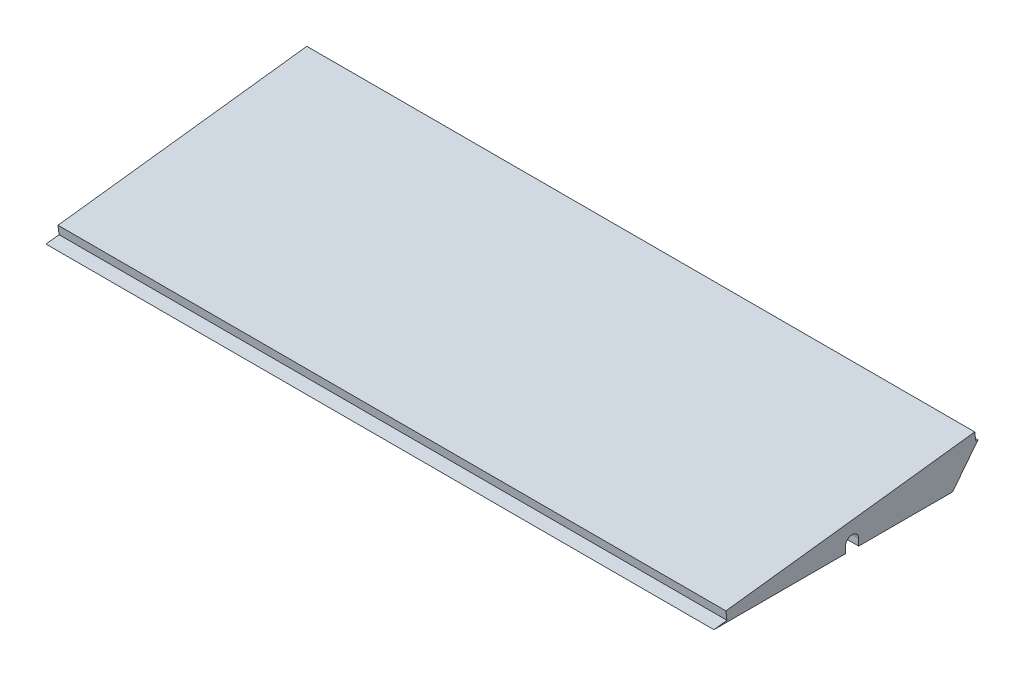
ISO-10303-21;
HEADER;
FILE_DESCRIPTION(('STEP AP214'),'2;1');
FILE_NAME('part.step','',(''),(''),'','','');
FILE_SCHEMA(('AUTOMOTIVE_DESIGN { 1 0 10303 214 1 1 1 1 }'));
ENDSEC;
DATA;
#1=APPLICATION_CONTEXT('core data for automotive mechanical design processes');
#2=APPLICATION_PROTOCOL_DEFINITION('international standard','automotive_design',2000,#1);
#3=PRODUCT_CONTEXT('',#1,'mechanical');
#4=PRODUCT('Part','Part','',(#3));
#5=PRODUCT_RELATED_PRODUCT_CATEGORY('part','',(#4));
#6=PRODUCT_DEFINITION_FORMATION('','',#4);
#7=PRODUCT_DEFINITION_CONTEXT('part definition',#1,'design');
#8=PRODUCT_DEFINITION('design','',#6,#7);
#9=PRODUCT_DEFINITION_SHAPE('','',#8);
#10=(LENGTH_UNIT() NAMED_UNIT(*) SI_UNIT(.MILLI.,.METRE.));
#11=(NAMED_UNIT(*) PLANE_ANGLE_UNIT() SI_UNIT($,.RADIAN.));
#12=(NAMED_UNIT(*) SI_UNIT($,.STERADIAN.) SOLID_ANGLE_UNIT());
#13=UNCERTAINTY_MEASURE_WITH_UNIT(LENGTH_MEASURE(1.E-05),#10,'distance_accuracy_value','');
#14=(GEOMETRIC_REPRESENTATION_CONTEXT(3) GLOBAL_UNCERTAINTY_ASSIGNED_CONTEXT((#13)) GLOBAL_UNIT_ASSIGNED_CONTEXT((#10,
#11,#12)) REPRESENTATION_CONTEXT('',''));
#15=CARTESIAN_POINT('',(0.,0.,0.));
#16=DIRECTION('',(0.,0.,1.));
#17=DIRECTION('',(1.,0.,0.));
#18=AXIS2_PLACEMENT_3D('',#15,#16,#17);
#19=CARTESIAN_POINT('',(149.1,2.02981539343471,-60.4874773736206));
#20=DIRECTION('',(0.,1.,0.));
#21=DIRECTION('',(0.,0.,1.));
#22=AXIS2_PLACEMENT_3D('',#19,#20,#21);
#23=PLANE('',#22);
#24=CARTESIAN_POINT('',(158.1,2.02981539343471,-69.4874773736206));
#25=DIRECTION('',(0.,1.,0.));
#26=DIRECTION('',(0.,0.,1.));
#27=AXIS2_PLACEMENT_3D('',#24,#25,#26);
#28=CIRCLE('',#27,6.);
#29=CARTESIAN_POINT('',(158.1,2.02981539343471,-63.4874773736206));
#30=VERTEX_POINT('',#29);
#31=CARTESIAN_POINT('',(152.1,2.02981539343471,-69.4874773736206));
#32=VERTEX_POINT('',#31);
#33=EDGE_CURVE('E294',#30,#32,#28,.F.);
#34=ORIENTED_EDGE('',*,*,#33,.F.);
#35=DIRECTION('',(1.,0.,0.));
#36=VECTOR('',#35,1.);
#37=CARTESIAN_POINT('',(149.1,2.02981539343471,-63.4874773736206));
#38=LINE('',#37,#36);
#39=CARTESIAN_POINT('',(152.1,2.02981539343471,-63.4874773736206));
#40=VERTEX_POINT('',#39);
#41=EDGE_CURVE('E288',#30,#40,#38,.F.);
#42=ORIENTED_EDGE('',*,*,#41,.T.);
#43=DIRECTION('',(0.,0.,1.));
#44=VECTOR('',#43,1.);
#45=CARTESIAN_POINT('',(152.1,2.02981539343471,-114.021488172834));
#46=LINE('',#45,#44);
#47=EDGE_CURVE('E291',#40,#32,#46,.F.);
#48=ORIENTED_EDGE('',*,*,#47,.T.);
#49=EDGE_LOOP('',(#34,#42,#48));
#50=FACE_BOUND('',#49,.T.);
#51=ADVANCED_FACE('F92',(#50),#23,.F.);
#52=CARTESIAN_POINT('',(0.,-3.97018460656529,0.));
#53=DIRECTION('',(0.,-1.,0.));
#54=DIRECTION('',(0.,0.,-1.));
#55=AXIS2_PLACEMENT_3D('',#52,#53,#54);
#56=PLANE('',#55);
#57=DIRECTION('',(1.,0.,0.));
#58=VECTOR('',#57,1.);
#59=CARTESIAN_POINT('',(0.,-3.97018460656529,-109.333774413794));
#60=LINE('',#59,#58);
#61=CARTESIAN_POINT('',(0.,-3.97018460656529,-109.333774413794));
#62=VERTEX_POINT('',#61);
#63=CARTESIAN_POINT('',(149.1,-3.97018460656529,-109.333774413794));
#64=VERTEX_POINT('',#63);
#65=EDGE_CURVE('E234',#62,#64,#60,.T.);
#66=ORIENTED_EDGE('',*,*,#65,.T.);
#67=DIRECTION('',(0.,0.,-1.));
#68=VECTOR('',#67,1.);
#69=CARTESIAN_POINT('',(149.1,-3.97018460656529,-60.4874773736206));
#70=LINE('',#69,#68);
#71=CARTESIAN_POINT('',(149.1,-3.97018460656529,-63.4874773736206));
#72=VERTEX_POINT('',#71);
#73=EDGE_CURVE('E217',#72,#64,#70,.T.);
#74=ORIENTED_EDGE('',*,*,#73,.F.);
#75=CARTESIAN_POINT('',(152.1,-3.97018460656529,-63.4874773736206));
#76=DIRECTION('',(0.,-1.,0.));
#77=DIRECTION('',(0.,0.,-1.));
#78=AXIS2_PLACEMENT_3D('',#75,#76,#77);
#79=CIRCLE('',#78,3.);
#80=CARTESIAN_POINT('',(152.1,-3.97018460656529,-60.4874773736206));
#81=VERTEX_POINT('',#80);
#82=EDGE_CURVE('E298',#72,#81,#79,.F.);
#83=ORIENTED_EDGE('',*,*,#82,.T.);
#84=DIRECTION('',(1.,0.,0.));
#85=VECTOR('',#84,1.);
#86=CARTESIAN_POINT('',(149.1,-3.97018460656529,-60.4874773736206));
#87=LINE('',#86,#85);
#88=CARTESIAN_POINT('',(304.5,-3.97018460656529,-60.4874773736206));
#89=VERTEX_POINT('',#88);
#90=EDGE_CURVE('E228',#81,#89,#87,.T.);
#91=ORIENTED_EDGE('',*,*,#90,.T.);
#92=DIRECTION('',(0.,0.,-1.));
#93=VECTOR('',#92,1.);
#94=CARTESIAN_POINT('',(304.5,-3.97018460656529,0.));
#95=LINE('',#94,#93);
#96=CARTESIAN_POINT('',(304.5,-3.97018460656529,-0.487477373620593));
#97=VERTEX_POINT('',#96);
#98=EDGE_CURVE('E255',#97,#89,#95,.T.);
#99=ORIENTED_EDGE('',*,*,#98,.F.);
#100=DIRECTION('',(1.,0.,0.));
#101=VECTOR('',#100,1.);
#102=CARTESIAN_POINT('',(0.,-3.97018460656529,-0.487477373620593));
#103=LINE('',#102,#101);
#104=CARTESIAN_POINT('',(0.,-3.97018460656529,-0.487477373620593));
#105=VERTEX_POINT('',#104);
#106=EDGE_CURVE('E369',#105,#97,#103,.T.);
#107=ORIENTED_EDGE('',*,*,#106,.F.);
#108=DIRECTION('',(0.,0.,-1.));
#109=VECTOR('',#108,1.);
#110=CARTESIAN_POINT('',(0.,-3.97018460656529,0.));
#111=LINE('',#110,#109);
#112=EDGE_CURVE('E244',#105,#62,#111,.T.);
#113=ORIENTED_EDGE('',*,*,#112,.T.);
#114=EDGE_LOOP('',(#66,#74,#83,#91,#99,#107,#113));
#115=FACE_BOUND('',#114,.T.);
#116=ADVANCED_FACE('F241',(#115),#56,.T.);
#117=CARTESIAN_POINT('',(0.,-19.8509230328264,-2.43738686810296));
#118=DIRECTION('',(1.,0.,0.));
#119=DIRECTION('',(0.,0.,-1.));
#120=AXIS2_PLACEMENT_3D('',#117,#118,#119);
#121=PLANE('',#120);
#122=DIRECTION('',(0.,-0.121869343405148,0.992546151641322));
#123=VECTOR('',#122,1.);
#124=CARTESIAN_POINT('',(0.,-3.97018460656529,-0.487477373620593));
#125=LINE('',#124,#123);
#126=CARTESIAN_POINT('',(0.,-3.2389685461344,-6.44275428346852));
#127=VERTEX_POINT('',#126);
#128=EDGE_CURVE('E375',#127,#105,#125,.T.);
#129=ORIENTED_EDGE('',*,*,#128,.F.);
#130=DIRECTION('',(0.,-0.992546151641322,-0.121869343405148));
#131=VECTOR('',#130,1.);
#132=CARTESIAN_POINT('',(0.,0.731216060430888,-5.95527690984793));
#133=LINE('',#132,#131);
#134=CARTESIAN_POINT('',(0.,0.731216060430888,-5.95527690984793));
#135=VERTEX_POINT('',#134);
#136=EDGE_CURVE('E364',#135,#127,#133,.T.);
#137=ORIENTED_EDGE('',*,*,#136,.F.);
#138=DIRECTION('',(0.,0.121869343405148,-0.992546151641322));
#139=VECTOR('',#138,1.);
#140=CARTESIAN_POINT('',(0.,0.,0.));
#141=LINE('',#140,#139);
#142=CARTESIAN_POINT('',(0.,14.6608820116393,-119.403302042451));
#143=VERTEX_POINT('',#142);
#144=EDGE_CURVE('E246',#135,#143,#141,.T.);
#145=ORIENTED_EDGE('',*,*,#144,.T.);
#146=DIRECTION('',(0.,-0.992546151641322,-0.121869343405145));
#147=VECTOR('',#146,1.);
#148=CARTESIAN_POINT('',(0.,14.6608820116393,-119.403302042451));
#149=LINE('',#148,#147);
#150=CARTESIAN_POINT('',(0.,10.690697405074,-119.890779416072));
#151=VERTEX_POINT('',#150);
#152=EDGE_CURVE('E390',#143,#151,#149,.T.);
#153=ORIENTED_EDGE('',*,*,#152,.T.);
#154=DIRECTION('',(0.,0.121869343405148,-0.992546151641322));
#155=VECTOR('',#154,1.);
#156=CARTESIAN_POINT('',(0.,10.690697405074,-119.890779416072));
#157=LINE('',#156,#155);
#158=CARTESIAN_POINT('',(0.,10.8125667484792,-120.883325567713));
#159=VERTEX_POINT('',#158);
#160=EDGE_CURVE('E398',#151,#159,#157,.T.);
#161=ORIENTED_EDGE('',*,*,#160,.T.);
#162=DIRECTION('',(0.,0.788010753606721,-0.61566147532566));
#163=VECTOR('',#162,1.);
#164=CARTESIAN_POINT('',(0.,-54.5479020359963,-69.8181307646611));
#165=LINE('',#164,#163);
#166=EDGE_CURVE('E410',#62,#159,#165,.T.);
#167=ORIENTED_EDGE('',*,*,#166,.F.);
#168=ORIENTED_EDGE('',*,*,#112,.F.);
#169=EDGE_LOOP('',(#129,#137,#145,#153,#161,#167,#168));
#170=FACE_BOUND('',#169,.T.);
#171=ADVANCED_FACE('F476',(#170),#121,.F.);
#172=CARTESIAN_POINT('',(304.5,-19.8509230328264,-2.43738686810296));
#173=DIRECTION('',(-1.,0.,0.));
#174=DIRECTION('',(0.,0.,1.));
#175=AXIS2_PLACEMENT_3D('',#172,#173,#174);
#176=PLANE('',#175);
#177=ORIENTED_EDGE('',*,*,#98,.T.);
#178=DIRECTION('',(0.,-1.,0.));
#179=VECTOR('',#178,1.);
#180=CARTESIAN_POINT('',(304.5,-3.97018460656529,-60.4874773736206));
#181=LINE('',#180,#179);
#182=CARTESIAN_POINT('',(304.5,-0.970184606565289,-60.4874773736206));
#183=VERTEX_POINT('',#182);
#184=EDGE_CURVE('E238',#183,#89,#181,.T.);
#185=ORIENTED_EDGE('',*,*,#184,.F.);
#186=CARTESIAN_POINT('',(304.5,-0.970184606565289,-63.4874773736206));
#187=DIRECTION('',(-1.,0.,0.));
#188=DIRECTION('',(0.,0.,1.));
#189=AXIS2_PLACEMENT_3D('',#186,#187,#188);
#190=CIRCLE('',#189,3.);
#191=CARTESIAN_POINT('',(304.5,2.02981539343471,-63.4874773736206));
#192=VERTEX_POINT('',#191);
#193=EDGE_CURVE('E12',#183,#192,#190,.T.);
#194=ORIENTED_EDGE('',*,*,#193,.T.);
#195=CARTESIAN_POINT('',(304.5,-0.970184606565289,-63.4874773736206));
#196=DIRECTION('',(-1.,0.,0.));
#197=DIRECTION('',(0.,0.,1.));
#198=AXIS2_PLACEMENT_3D('',#195,#196,#197);
#199=CIRCLE('',#198,3.);
#200=CARTESIAN_POINT('',(304.5,-0.970184606565289,-66.4874773736206));
#201=VERTEX_POINT('',#200);
#202=EDGE_CURVE('E102',#192,#201,#199,.T.);
#203=ORIENTED_EDGE('',*,*,#202,.T.);
#204=DIRECTION('',(0.,1.,0.));
#205=VECTOR('',#204,1.);
#206=CARTESIAN_POINT('',(304.5,-3.97018460656529,-66.4874773736206));
#207=LINE('',#206,#205);
#208=CARTESIAN_POINT('',(304.5,-3.97018460656529,-66.4874773736206));
#209=VERTEX_POINT('',#208);
#210=EDGE_CURVE('E229',#209,#201,#207,.T.);
#211=ORIENTED_EDGE('',*,*,#210,.F.);
#212=CARTESIAN_POINT('',(304.5,-3.97018460656529,-109.333774413794));
#213=VERTEX_POINT('',#212);
#214=EDGE_CURVE('E416',#209,#213,#95,.T.);
#215=ORIENTED_EDGE('',*,*,#214,.T.);
#216=DIRECTION('',(0.,0.788010753606721,-0.61566147532566));
#217=VECTOR('',#216,1.);
#218=CARTESIAN_POINT('',(304.5,-54.5479020359963,-69.8181307646611));
#219=LINE('',#218,#217);
#220=CARTESIAN_POINT('',(304.5,10.8125667484792,-120.883325567713));
#221=VERTEX_POINT('',#220);
#222=EDGE_CURVE('E379',#213,#221,#219,.T.);
#223=ORIENTED_EDGE('',*,*,#222,.T.);
#224=DIRECTION('',(0.,0.121869343405148,-0.992546151641322));
#225=VECTOR('',#224,1.);
#226=CARTESIAN_POINT('',(304.5,10.690697405074,-119.890779416072));
#227=LINE('',#226,#225);
#228=CARTESIAN_POINT('',(304.5,10.690697405074,-119.890779416072));
#229=VERTEX_POINT('',#228);
#230=EDGE_CURVE('E386',#229,#221,#227,.T.);
#231=ORIENTED_EDGE('',*,*,#230,.F.);
#232=DIRECTION('',(0.,-0.992546151641322,-0.121869343405145));
#233=VECTOR('',#232,1.);
#234=CARTESIAN_POINT('',(304.5,14.6608820116393,-119.403302042451));
#235=LINE('',#234,#233);
#236=CARTESIAN_POINT('',(304.5,14.6608820116393,-119.403302042451));
#237=VERTEX_POINT('',#236);
#238=EDGE_CURVE('E394',#237,#229,#235,.T.);
#239=ORIENTED_EDGE('',*,*,#238,.F.);
#240=DIRECTION('',(0.,-0.121869343405148,0.992546151641322));
#241=VECTOR('',#240,1.);
#242=CARTESIAN_POINT('',(304.5,0.,0.));
#243=LINE('',#242,#241);
#244=CARTESIAN_POINT('',(304.5,0.731216060430888,-5.95527690984793));
#245=VERTEX_POINT('',#244);
#246=EDGE_CURVE('E252',#237,#245,#243,.T.);
#247=ORIENTED_EDGE('',*,*,#246,.T.);
#248=DIRECTION('',(0.,-0.992546151641322,-0.121869343405148));
#249=VECTOR('',#248,1.);
#250=CARTESIAN_POINT('',(304.5,0.731216060430888,-5.95527690984793));
#251=LINE('',#250,#249);
#252=CARTESIAN_POINT('',(304.5,-3.2389685461344,-6.44275428346852));
#253=VERTEX_POINT('',#252);
#254=EDGE_CURVE('E370',#245,#253,#251,.T.);
#255=ORIENTED_EDGE('',*,*,#254,.T.);
#256=DIRECTION('',(0.,-0.121869343405148,0.992546151641322));
#257=VECTOR('',#256,1.);
#258=CARTESIAN_POINT('',(304.5,-3.97018460656529,-0.487477373620593));
#259=LINE('',#258,#257);
#260=EDGE_CURVE('E374',#253,#97,#259,.T.);
#261=ORIENTED_EDGE('',*,*,#260,.T.);
#262=EDGE_LOOP('',(#177,#185,#194,#203,#211,#215,#223,#231,#239,#247,#255,#261));
#263=FACE_BOUND('',#262,.T.);
#264=ADVANCED_FACE('F426',(#263),#176,.F.);
#265=CARTESIAN_POINT('',(0.,0.,0.));
#266=DIRECTION('',(0.,0.992546151641322,0.121869343405148));
#267=DIRECTION('',(0.,-0.121869343405148,0.992546151641322));
#268=AXIS2_PLACEMENT_3D('',#265,#266,#267);
#269=PLANE('',#268);
#270=ORIENTED_EDGE('',*,*,#144,.F.);
#271=DIRECTION('',(1.,0.,0.));
#272=VECTOR('',#271,1.);
#273=CARTESIAN_POINT('',(0.,0.731216060430888,-5.95527690984793));
#274=LINE('',#273,#272);
#275=EDGE_CURVE('E365',#135,#245,#274,.T.);
#276=ORIENTED_EDGE('',*,*,#275,.T.);
#277=ORIENTED_EDGE('',*,*,#246,.F.);
#278=DIRECTION('',(1.,0.,0.));
#279=VECTOR('',#278,1.);
#280=CARTESIAN_POINT('',(0.,14.6608820116393,-119.403302042451));
#281=LINE('',#280,#279);
#282=EDGE_CURVE('E387',#143,#237,#281,.T.);
#283=ORIENTED_EDGE('',*,*,#282,.F.);
#284=EDGE_LOOP('',(#270,#276,#277,#283));
#285=FACE_BOUND('',#284,.T.);
#286=ADVANCED_FACE('F501',(#285),#269,.T.);
#287=CARTESIAN_POINT('',(0.,-54.5479020359963,-69.8181307646611));
#288=DIRECTION('',(0.,-0.61566147532566,-0.788010753606721));
#289=DIRECTION('',(0.,0.788010753606721,-0.61566147532566));
#290=AXIS2_PLACEMENT_3D('',#287,#288,#289);
#291=PLANE('',#290);
#292=DIRECTION('',(0.,0.788010753606721,-0.61566147532566));
#293=VECTOR('',#292,1.);
#294=CARTESIAN_POINT('',(149.1,-54.5479020359963,-69.8181307646611));
#295=LINE('',#294,#293);
#296=CARTESIAN_POINT('',(149.1,-0.970184606565283,-111.677631293314));
#297=VERTEX_POINT('',#296);
#298=EDGE_CURVE('E220',#64,#297,#295,.T.);
#299=ORIENTED_EDGE('',*,*,#298,.F.);
#300=ORIENTED_EDGE('',*,*,#65,.F.);
#301=ORIENTED_EDGE('',*,*,#166,.T.);
#302=DIRECTION('',(1.,0.,0.));
#303=VECTOR('',#302,1.);
#304=CARTESIAN_POINT('',(0.,10.8125667484792,-120.883325567713));
#305=LINE('',#304,#303);
#306=EDGE_CURVE('E358',#159,#221,#305,.T.);
#307=ORIENTED_EDGE('',*,*,#306,.T.);
#308=ORIENTED_EDGE('',*,*,#222,.F.);
#309=CARTESIAN_POINT('',(155.1,-3.97018460656529,-109.333774413794));
#310=VERTEX_POINT('',#309);
#311=EDGE_CURVE('E247',#310,#213,#60,.T.);
#312=ORIENTED_EDGE('',*,*,#311,.F.);
#313=DIRECTION('',(0.,-0.788010753606721,0.61566147532566));
#314=VECTOR('',#313,1.);
#315=CARTESIAN_POINT('',(155.1,-54.5479020359963,-69.8181307646611));
#316=LINE('',#315,#314);
#317=CARTESIAN_POINT('',(155.1,-0.970184606565283,-111.677631293314));
#318=VERTEX_POINT('',#317);
#319=EDGE_CURVE('E239',#318,#310,#316,.T.);
#320=ORIENTED_EDGE('',*,*,#319,.F.);
#321=CARTESIAN_POINT('',(152.1,-0.970184606565289,-111.677631293314));
#322=DIRECTION('',(0.,-0.61566147532566,-0.788010753606721));
#323=DIRECTION('',(0.,0.788010753606721,-0.61566147532566));
#324=AXIS2_PLACEMENT_3D('',#321,#322,#323);
#325=ELLIPSE('',#324,3.80705464521774,3.);
#326=CARTESIAN_POINT('',(152.1,2.02981539343471,-114.021488172834));
#327=VERTEX_POINT('',#326);
#328=EDGE_CURVE('E116',#318,#327,#325,.F.);
#329=ORIENTED_EDGE('',*,*,#328,.T.);
#330=CARTESIAN_POINT('',(152.1,-0.970184606565289,-111.677631293314));
#331=DIRECTION('',(0.,-0.61566147532566,-0.788010753606721));
#332=DIRECTION('',(0.,0.788010753606721,-0.61566147532566));
#333=AXIS2_PLACEMENT_3D('',#330,#331,#332);
#334=ELLIPSE('',#333,3.80705464521774,3.);
#335=EDGE_CURVE('E236',#327,#297,#334,.F.);
#336=ORIENTED_EDGE('',*,*,#335,.T.);
#337=EDGE_LOOP('',(#299,#300,#301,#307,#308,#312,#320,#329,#336));
#338=FACE_BOUND('',#337,.T.);
#339=ADVANCED_FACE('F232',(#338),#291,.T.);
#340=DIRECTION('',(1.,0.,0.));
#341=VECTOR('',#340,1.);
#342=CARTESIAN_POINT('',(149.1,-3.97018460656529,-66.4874773736206));
#343=LINE('',#342,#341);
#344=CARTESIAN_POINT('',(158.1,-3.97018460656529,-66.4874773736206));
#345=VERTEX_POINT('',#344);
#346=EDGE_CURVE('E355',#345,#209,#343,.T.);
#347=ORIENTED_EDGE('',*,*,#346,.F.);
#348=CARTESIAN_POINT('',(158.1,-3.97018460656529,-69.4874773736206));
#349=DIRECTION('',(0.,-1.,0.));
#350=DIRECTION('',(0.,0.,-1.));
#351=AXIS2_PLACEMENT_3D('',#348,#349,#350);
#352=CIRCLE('',#351,3.);
#353=CARTESIAN_POINT('',(155.1,-3.97018460656529,-69.4874773736206));
#354=VERTEX_POINT('',#353);
#355=EDGE_CURVE('E274',#345,#354,#352,.T.);
#356=ORIENTED_EDGE('',*,*,#355,.T.);
#357=DIRECTION('',(0.,0.,1.));
#358=VECTOR('',#357,1.);
#359=CARTESIAN_POINT('',(155.1,-3.97018460656529,-120.883325567713));
#360=LINE('',#359,#358);
#361=EDGE_CURVE('E336',#310,#354,#360,.T.);
#362=ORIENTED_EDGE('',*,*,#361,.F.);
#363=ORIENTED_EDGE('',*,*,#311,.T.);
#364=ORIENTED_EDGE('',*,*,#214,.F.);
#365=EDGE_LOOP('',(#347,#356,#362,#363,#364));
#366=FACE_BOUND('',#365,.T.);
#367=ADVANCED_FACE('F448',(#366),#56,.T.);
#368=CARTESIAN_POINT('',(0.,-3.97018460656529,-0.487477373620593));
#369=DIRECTION('',(0.,0.992546151641322,0.121869343405148));
#370=DIRECTION('',(0.,-0.121869343405148,0.992546151641322));
#371=AXIS2_PLACEMENT_3D('',#368,#369,#370);
#372=PLANE('',#371);
#373=ORIENTED_EDGE('',*,*,#260,.F.);
#374=DIRECTION('',(1.,0.,0.));
#375=VECTOR('',#374,1.);
#376=CARTESIAN_POINT('',(0.,-3.2389685461344,-6.44275428346852));
#377=LINE('',#376,#375);
#378=EDGE_CURVE('E361',#127,#253,#377,.T.);
#379=ORIENTED_EDGE('',*,*,#378,.F.);
#380=ORIENTED_EDGE('',*,*,#128,.T.);
#381=ORIENTED_EDGE('',*,*,#106,.T.);
#382=EDGE_LOOP('',(#373,#379,#380,#381));
#383=FACE_BOUND('',#382,.T.);
#384=ADVANCED_FACE('F485',(#383),#372,.T.);
#385=CARTESIAN_POINT('',(0.,0.731216060430888,-5.95527690984793));
#386=DIRECTION('',(0.,-0.121869343405148,0.992546151641322));
#387=DIRECTION('',(0.,-0.992546151641322,-0.121869343405148));
#388=AXIS2_PLACEMENT_3D('',#385,#386,#387);
#389=PLANE('',#388);
#390=ORIENTED_EDGE('',*,*,#254,.F.);
#391=ORIENTED_EDGE('',*,*,#275,.F.);
#392=ORIENTED_EDGE('',*,*,#136,.T.);
#393=ORIENTED_EDGE('',*,*,#378,.T.);
#394=EDGE_LOOP('',(#390,#391,#392,#393));
#395=FACE_BOUND('',#394,.T.);
#396=ADVANCED_FACE('F488',(#395),#389,.T.);
#397=CARTESIAN_POINT('',(0.,10.690697405074,-119.890779416072));
#398=DIRECTION('',(0.,-0.992546151641322,-0.121869343405148));
#399=DIRECTION('',(0.,0.121869343405148,-0.992546151641322));
#400=AXIS2_PLACEMENT_3D('',#397,#398,#399);
#401=PLANE('',#400);
#402=ORIENTED_EDGE('',*,*,#230,.T.);
#403=ORIENTED_EDGE('',*,*,#306,.F.);
#404=ORIENTED_EDGE('',*,*,#160,.F.);
#405=DIRECTION('',(1.,0.,0.));
#406=VECTOR('',#405,1.);
#407=CARTESIAN_POINT('',(0.,10.690697405074,-119.890779416072));
#408=LINE('',#407,#406);
#409=EDGE_CURVE('E391',#151,#229,#408,.T.);
#410=ORIENTED_EDGE('',*,*,#409,.T.);
#411=EDGE_LOOP('',(#402,#403,#404,#410));
#412=FACE_BOUND('',#411,.T.);
#413=ADVANCED_FACE('F490',(#412),#401,.F.);
#414=CARTESIAN_POINT('',(0.,14.6608820116393,-119.403302042451));
#415=DIRECTION('',(0.,-0.121869343405145,0.992546151641322));
#416=DIRECTION('',(0.,-0.992546151641322,-0.121869343405145));
#417=AXIS2_PLACEMENT_3D('',#414,#415,#416);
#418=PLANE('',#417);
#419=ORIENTED_EDGE('',*,*,#238,.T.);
#420=ORIENTED_EDGE('',*,*,#409,.F.);
#421=ORIENTED_EDGE('',*,*,#152,.F.);
#422=ORIENTED_EDGE('',*,*,#282,.T.);
#423=EDGE_LOOP('',(#419,#420,#421,#422));
#424=FACE_BOUND('',#423,.T.);
#425=ADVANCED_FACE('F484',(#424),#418,.F.);
#426=CARTESIAN_POINT('',(149.1,-3.97018460656529,-60.4874773736206));
#427=DIRECTION('',(0.,0.,1.));
#428=DIRECTION('',(1.,0.,0.));
#429=AXIS2_PLACEMENT_3D('',#426,#427,#428);
#430=PLANE('',#429);
#431=ORIENTED_EDGE('',*,*,#90,.F.);
#432=DIRECTION('',(0.,-1.,0.));
#433=VECTOR('',#432,1.);
#434=CARTESIAN_POINT('',(152.1,2.02981539343471,-60.4874773736206));
#435=LINE('',#434,#433);
#436=CARTESIAN_POINT('',(152.1,-0.970184606565289,-60.4874773736206));
#437=VERTEX_POINT('',#436);
#438=EDGE_CURVE('E285',#81,#437,#435,.F.);
#439=ORIENTED_EDGE('',*,*,#438,.T.);
#440=DIRECTION('',(1.,0.,0.));
#441=VECTOR('',#440,1.);
#442=CARTESIAN_POINT('',(304.5,-0.970184606565289,-60.4874773736206));
#443=LINE('',#442,#441);
#444=EDGE_CURVE('E282',#437,#183,#443,.T.);
#445=ORIENTED_EDGE('',*,*,#444,.T.);
#446=ORIENTED_EDGE('',*,*,#184,.T.);
#447=EDGE_LOOP('',(#431,#439,#445,#446));
#448=FACE_BOUND('',#447,.T.);
#449=ADVANCED_FACE('F431',(#448),#430,.F.);
#450=CARTESIAN_POINT('',(149.1,-3.97018460656529,-66.4874773736206));
#451=DIRECTION('',(0.,0.,-1.));
#452=DIRECTION('',(-1.,0.,0.));
#453=AXIS2_PLACEMENT_3D('',#450,#451,#452);
#454=PLANE('',#453);
#455=DIRECTION('',(1.,0.,0.));
#456=VECTOR('',#455,1.);
#457=CARTESIAN_POINT('',(155.1,-0.970184606565289,-66.4874773736206));
#458=LINE('',#457,#456);
#459=CARTESIAN_POINT('',(158.1,-0.970184606565289,-66.4874773736206));
#460=VERTEX_POINT('',#459);
#461=EDGE_CURVE('E268',#201,#460,#458,.F.);
#462=ORIENTED_EDGE('',*,*,#461,.T.);
#463=DIRECTION('',(0.,1.,0.));
#464=VECTOR('',#463,1.);
#465=CARTESIAN_POINT('',(158.1,-3.97018460656529,-66.4874773736206));
#466=LINE('',#465,#464);
#467=EDGE_CURVE('E271',#460,#345,#466,.F.);
#468=ORIENTED_EDGE('',*,*,#467,.T.);
#469=ORIENTED_EDGE('',*,*,#346,.T.);
#470=ORIENTED_EDGE('',*,*,#210,.T.);
#471=EDGE_LOOP('',(#462,#468,#469,#470));
#472=FACE_BOUND('',#471,.T.);
#473=ADVANCED_FACE('F443',(#472),#454,.F.);
#474=CARTESIAN_POINT('',(149.1,0.,0.));
#475=DIRECTION('',(-1.,0.,0.));
#476=DIRECTION('',(0.,0.,1.));
#477=AXIS2_PLACEMENT_3D('',#474,#475,#476);
#478=PLANE('',#477);
#479=DIRECTION('',(0.,0.,1.));
#480=VECTOR('',#479,1.);
#481=CARTESIAN_POINT('',(149.1,-0.970184606565289,-60.4874773736206));
#482=LINE('',#481,#480);
#483=CARTESIAN_POINT('',(149.1,-0.970184606565289,-63.4874773736206));
#484=VERTEX_POINT('',#483);
#485=EDGE_CURVE('E277',#297,#484,#482,.T.);
#486=ORIENTED_EDGE('',*,*,#485,.T.);
#487=DIRECTION('',(0.,-1.,0.));
#488=VECTOR('',#487,1.);
#489=CARTESIAN_POINT('',(149.1,-3.97018460656529,-63.4874773736206));
#490=LINE('',#489,#488);
#491=EDGE_CURVE('E223',#484,#72,#490,.T.);
#492=ORIENTED_EDGE('',*,*,#491,.T.);
#493=ORIENTED_EDGE('',*,*,#73,.T.);
#494=ORIENTED_EDGE('',*,*,#298,.T.);
#495=EDGE_LOOP('',(#486,#492,#493,#494));
#496=FACE_BOUND('',#495,.T.);
#497=ADVANCED_FACE('F219',(#496),#478,.F.);
#498=CARTESIAN_POINT('',(155.1,-3.97018460656529,-120.883325567713));
#499=DIRECTION('',(1.,0.,0.));
#500=DIRECTION('',(0.,0.,-1.));
#501=AXIS2_PLACEMENT_3D('',#498,#499,#500);
#502=PLANE('',#501);
#503=ORIENTED_EDGE('',*,*,#361,.T.);
#504=DIRECTION('',(0.,1.,0.));
#505=VECTOR('',#504,1.);
#506=CARTESIAN_POINT('',(155.1,-3.97018460656529,-69.4874773736206));
#507=LINE('',#506,#505);
#508=CARTESIAN_POINT('',(155.1,-0.970184606565289,-69.4874773736206));
#509=VERTEX_POINT('',#508);
#510=EDGE_CURVE('E264',#354,#509,#507,.T.);
#511=ORIENTED_EDGE('',*,*,#510,.T.);
#512=DIRECTION('',(0.,0.,1.));
#513=VECTOR('',#512,1.);
#514=CARTESIAN_POINT('',(155.1,-0.970184606565289,-114.021488172834));
#515=LINE('',#514,#513);
#516=EDGE_CURVE('E261',#509,#318,#515,.F.);
#517=ORIENTED_EDGE('',*,*,#516,.T.);
#518=ORIENTED_EDGE('',*,*,#319,.T.);
#519=EDGE_LOOP('',(#503,#511,#517,#518));
#520=FACE_BOUND('',#519,.T.);
#521=ADVANCED_FACE('F452',(#520),#502,.F.);
#522=CARTESIAN_POINT('',(152.1,0.,-63.4874773736206));
#523=DIRECTION('',(0.,1.,0.));
#524=DIRECTION('',(0.,0.,1.));
#525=AXIS2_PLACEMENT_3D('',#522,#523,#524);
#526=CYLINDRICAL_SURFACE('',#525,3.);
#527=CARTESIAN_POINT('',(152.1,-0.970184606565289,-63.4874773736206));
#528=DIRECTION('',(0.,-1.,0.));
#529=DIRECTION('',(0.,0.,-1.));
#530=AXIS2_PLACEMENT_3D('',#527,#528,#529);
#531=CIRCLE('',#530,3.);
#532=EDGE_CURVE('E96',#437,#484,#531,.T.);
#533=ORIENTED_EDGE('',*,*,#532,.F.);
#534=ORIENTED_EDGE('',*,*,#438,.F.);
#535=ORIENTED_EDGE('',*,*,#82,.F.);
#536=ORIENTED_EDGE('',*,*,#491,.F.);
#537=EDGE_LOOP('',(#533,#534,#535,#536));
#538=FACE_BOUND('',#537,.T.);
#539=ADVANCED_FACE('F94',(#538),#526,.F.);
#540=CARTESIAN_POINT('',(152.1,-0.970184606565289,-63.4874773736206));
#541=DIRECTION('',(0.,0.,1.));
#542=DIRECTION('',(1.,0.,0.));
#543=AXIS2_PLACEMENT_3D('',#540,#541,#542);
#544=SPHERICAL_SURFACE('',#543,3.);
#545=CARTESIAN_POINT('',(152.1,-0.970184606565289,-63.4874773736206));
#546=DIRECTION('',(1.,0.,0.));
#547=DIRECTION('',(0.,0.,-1.));
#548=AXIS2_PLACEMENT_3D('',#545,#546,#547);
#549=CIRCLE('',#548,3.);
#550=EDGE_CURVE('E325',#437,#40,#549,.F.);
#551=ORIENTED_EDGE('',*,*,#550,.F.);
#552=ORIENTED_EDGE('',*,*,#532,.T.);
#553=CARTESIAN_POINT('',(152.1,-0.970184606565289,-63.4874773736206));
#554=DIRECTION('',(0.,0.,-1.));
#555=DIRECTION('',(-1.,0.,0.));
#556=AXIS2_PLACEMENT_3D('',#553,#554,#555);
#557=CIRCLE('',#556,3.);
#558=EDGE_CURVE('E328',#40,#484,#557,.F.);
#559=ORIENTED_EDGE('',*,*,#558,.F.);
#560=EDGE_LOOP('',(#551,#552,#559));
#561=FACE_BOUND('',#560,.T.);
#562=ADVANCED_FACE('F461',(#561),#544,.F.);
#563=CARTESIAN_POINT('',(152.1,-0.970184606565289,0.));
#564=DIRECTION('',(0.,0.,-1.));
#565=DIRECTION('',(-1.,0.,0.));
#566=AXIS2_PLACEMENT_3D('',#563,#564,#565);
#567=CYLINDRICAL_SURFACE('',#566,3.);
#568=ORIENTED_EDGE('',*,*,#485,.F.);
#569=ORIENTED_EDGE('',*,*,#335,.F.);
#570=DIRECTION('',(0.,0.,1.));
#571=VECTOR('',#570,1.);
#572=CARTESIAN_POINT('',(152.1,2.02981539343471,-114.021488172834));
#573=LINE('',#572,#571);
#574=EDGE_CURVE('E321',#32,#327,#573,.F.);
#575=ORIENTED_EDGE('',*,*,#574,.F.);
#576=ORIENTED_EDGE('',*,*,#47,.F.);
#577=ORIENTED_EDGE('',*,*,#558,.T.);
#578=EDGE_LOOP('',(#568,#569,#575,#576,#577));
#579=FACE_BOUND('',#578,.T.);
#580=ADVANCED_FACE('F459',(#579),#567,.F.);
#581=CARTESIAN_POINT('',(149.1,-0.970184606565289,-63.4874773736206));
#582=DIRECTION('',(-1.,0.,0.));
#583=DIRECTION('',(0.,0.,1.));
#584=AXIS2_PLACEMENT_3D('',#581,#582,#583);
#585=CYLINDRICAL_SURFACE('',#584,3.);
#586=ORIENTED_EDGE('',*,*,#550,.T.);
#587=ORIENTED_EDGE('',*,*,#41,.F.);
#588=DIRECTION('',(1.,0.,0.));
#589=VECTOR('',#588,1.);
#590=CARTESIAN_POINT('',(149.1,2.02981539343471,-63.4874773736206));
#591=LINE('',#590,#589);
#592=EDGE_CURVE('E317',#192,#30,#591,.F.);
#593=ORIENTED_EDGE('',*,*,#592,.F.);
#594=ORIENTED_EDGE('',*,*,#193,.F.);
#595=ORIENTED_EDGE('',*,*,#444,.F.);
#596=EDGE_LOOP('',(#586,#587,#593,#594,#595));
#597=FACE_BOUND('',#596,.T.);
#598=ADVANCED_FACE('F434',(#597),#585,.F.);
#599=CARTESIAN_POINT('',(152.1,-0.970184606565289,-60.4874773736206));
#600=DIRECTION('',(0.,0.,-1.));
#601=DIRECTION('',(-1.,0.,0.));
#602=AXIS2_PLACEMENT_3D('',#599,#600,#601);
#603=CYLINDRICAL_SURFACE('',#602,3.);
#604=ORIENTED_EDGE('',*,*,#328,.F.);
#605=ORIENTED_EDGE('',*,*,#516,.F.);
#606=CARTESIAN_POINT('',(152.1,-0.970184606565289,-69.4874773736206));
#607=DIRECTION('',(0.,0.,-1.));
#608=DIRECTION('',(-1.,0.,0.));
#609=AXIS2_PLACEMENT_3D('',#606,#607,#608);
#610=CIRCLE('',#609,3.);
#611=EDGE_CURVE('E313',#32,#509,#610,.T.);
#612=ORIENTED_EDGE('',*,*,#611,.F.);
#613=ORIENTED_EDGE('',*,*,#574,.T.);
#614=EDGE_LOOP('',(#604,#605,#612,#613));
#615=FACE_BOUND('',#614,.T.);
#616=ADVANCED_FACE('F457',(#615),#603,.F.);
#617=CARTESIAN_POINT('',(149.1,-0.970184606565289,-63.4874773736206));
#618=DIRECTION('',(-1.,0.,0.));
#619=DIRECTION('',(0.,0.,1.));
#620=AXIS2_PLACEMENT_3D('',#617,#618,#619);
#621=CYLINDRICAL_SURFACE('',#620,3.);
#622=ORIENTED_EDGE('',*,*,#202,.F.);
#623=ORIENTED_EDGE('',*,*,#592,.T.);
#624=CARTESIAN_POINT('',(158.1,-0.970184606565289,-63.4874773736206));
#625=DIRECTION('',(1.,0.,0.));
#626=DIRECTION('',(0.,0.,-1.));
#627=AXIS2_PLACEMENT_3D('',#624,#625,#626);
#628=CIRCLE('',#627,3.);
#629=EDGE_CURVE('E310',#460,#30,#628,.T.);
#630=ORIENTED_EDGE('',*,*,#629,.F.);
#631=ORIENTED_EDGE('',*,*,#461,.F.);
#632=EDGE_LOOP('',(#622,#623,#630,#631));
#633=FACE_BOUND('',#632,.T.);
#634=ADVANCED_FACE('F441',(#633),#621,.F.);
#635=CARTESIAN_POINT('',(158.1,-0.970184606565289,-69.4874773736206));
#636=DIRECTION('',(0.,1.,0.));
#637=DIRECTION('',(0.,0.,1.));
#638=AXIS2_PLACEMENT_3D('',#635,#636,#637);
#639=TOROIDAL_SURFACE('',#638,6.,3.);
#640=ORIENTED_EDGE('',*,*,#33,.T.);
#641=ORIENTED_EDGE('',*,*,#611,.T.);
#642=CARTESIAN_POINT('',(158.1,-0.970184606565289,-69.4874773736206));
#643=DIRECTION('',(0.,1.,0.));
#644=DIRECTION('',(0.,0.,1.));
#645=AXIS2_PLACEMENT_3D('',#642,#643,#644);
#646=CIRCLE('',#645,3.);
#647=EDGE_CURVE('E307',#460,#509,#646,.F.);
#648=ORIENTED_EDGE('',*,*,#647,.F.);
#649=ORIENTED_EDGE('',*,*,#629,.T.);
#650=EDGE_LOOP('',(#640,#641,#648,#649));
#651=FACE_BOUND('',#650,.T.);
#652=ADVANCED_FACE('F514',(#651),#639,.F.);
#653=CARTESIAN_POINT('',(158.1,-3.97018460656529,-69.4874773736206));
#654=DIRECTION('',(0.,1.,0.));
#655=DIRECTION('',(0.,0.,1.));
#656=AXIS2_PLACEMENT_3D('',#653,#654,#655);
#657=CYLINDRICAL_SURFACE('',#656,3.);
#658=ORIENTED_EDGE('',*,*,#355,.F.);
#659=ORIENTED_EDGE('',*,*,#467,.F.);
#660=ORIENTED_EDGE('',*,*,#647,.T.);
#661=ORIENTED_EDGE('',*,*,#510,.F.);
#662=EDGE_LOOP('',(#658,#659,#660,#661));
#663=FACE_BOUND('',#662,.T.);
#664=ADVANCED_FACE('F450',(#663),#657,.T.);
#665=CLOSED_SHELL('',(#51,#116,#171,#264,#286,#339,#367,#384,#396,#413,#425,#449,#473,#497,#521,
#539,#562,#580,#598,#616,#634,#652,#664));
#666=MANIFOLD_SOLID_BREP('B2',#665);
#667=ADVANCED_BREP_SHAPE_REPRESENTATION('',(#18,#666),#14);
#668=SHAPE_DEFINITION_REPRESENTATION(#9,#667);
ENDSEC;
END-ISO-10303-21;
